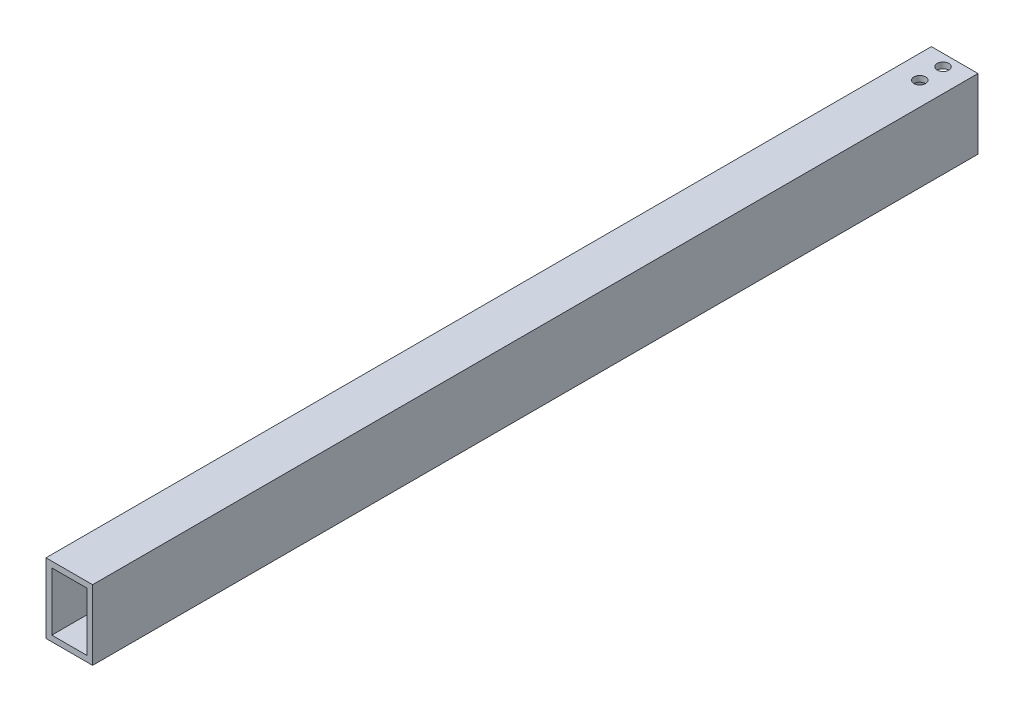
ISO-10303-21;
HEADER;
FILE_DESCRIPTION(('STEP AP214'),'2;1');
FILE_NAME('part.step','',(''),(''),'','','');
FILE_SCHEMA(('AUTOMOTIVE_DESIGN { 1 0 10303 214 1 1 1 1 }'));
ENDSEC;
DATA;
#1=APPLICATION_CONTEXT('core data for automotive mechanical design processes');
#2=APPLICATION_PROTOCOL_DEFINITION('international standard','automotive_design',2000,#1);
#3=PRODUCT_CONTEXT('',#1,'mechanical');
#4=PRODUCT('Part','Part','',(#3));
#5=PRODUCT_RELATED_PRODUCT_CATEGORY('part','',(#4));
#6=PRODUCT_DEFINITION_FORMATION('','',#4);
#7=PRODUCT_DEFINITION_CONTEXT('part definition',#1,'design');
#8=PRODUCT_DEFINITION('design','',#6,#7);
#9=PRODUCT_DEFINITION_SHAPE('','',#8);
#10=(LENGTH_UNIT() NAMED_UNIT(*) SI_UNIT(.MILLI.,.METRE.));
#11=(NAMED_UNIT(*) PLANE_ANGLE_UNIT() SI_UNIT($,.RADIAN.));
#12=(NAMED_UNIT(*) SI_UNIT($,.STERADIAN.) SOLID_ANGLE_UNIT());
#13=UNCERTAINTY_MEASURE_WITH_UNIT(LENGTH_MEASURE(1.E-05),#10,'distance_accuracy_value','');
#14=(GEOMETRIC_REPRESENTATION_CONTEXT(3) GLOBAL_UNCERTAINTY_ASSIGNED_CONTEXT((#13)) GLOBAL_UNIT_ASSIGNED_CONTEXT((#10,
#11,#12)) REPRESENTATION_CONTEXT('',''));
#15=CARTESIAN_POINT('',(0.,0.,0.));
#16=DIRECTION('',(0.,0.,1.));
#17=DIRECTION('',(1.,0.,0.));
#18=AXIS2_PLACEMENT_3D('',#15,#16,#17);
#19=CARTESIAN_POINT('',(0.,0.,482.6));
#20=DIRECTION('',(0.,0.,1.));
#21=DIRECTION('',(1.,0.,0.));
#22=AXIS2_PLACEMENT_3D('',#19,#20,#21);
#23=PLANE('',#22);
#24=DIRECTION('',(0.,1.,0.));
#25=VECTOR('',#24,1.);
#26=CARTESIAN_POINT('',(12.7,19.05,482.6));
#27=LINE('',#26,#25);
#28=CARTESIAN_POINT('',(12.7,-19.05,482.6));
#29=VERTEX_POINT('',#28);
#30=CARTESIAN_POINT('',(12.7,19.05,482.6));
#31=VERTEX_POINT('',#30);
#32=EDGE_CURVE('E142',#29,#31,#27,.T.);
#33=ORIENTED_EDGE('',*,*,#32,.T.);
#34=DIRECTION('',(-1.,0.,0.));
#35=VECTOR('',#34,1.);
#36=CARTESIAN_POINT('',(-12.7,19.05,482.6));
#37=LINE('',#36,#35);
#38=CARTESIAN_POINT('',(-12.7,19.05,482.6));
#39=VERTEX_POINT('',#38);
#40=EDGE_CURVE('E145',#31,#39,#37,.T.);
#41=ORIENTED_EDGE('',*,*,#40,.T.);
#42=DIRECTION('',(0.,-1.,0.));
#43=VECTOR('',#42,1.);
#44=CARTESIAN_POINT('',(-12.7,19.05,482.6));
#45=LINE('',#44,#43);
#46=CARTESIAN_POINT('',(-12.7,-19.05,482.6));
#47=VERTEX_POINT('',#46);
#48=EDGE_CURVE('E148',#39,#47,#45,.T.);
#49=ORIENTED_EDGE('',*,*,#48,.T.);
#50=DIRECTION('',(1.,0.,0.));
#51=VECTOR('',#50,1.);
#52=CARTESIAN_POINT('',(-12.7,-19.05,482.6));
#53=LINE('',#52,#51);
#54=EDGE_CURVE('E150',#47,#29,#53,.T.);
#55=ORIENTED_EDGE('',*,*,#54,.T.);
#56=EDGE_LOOP('',(#33,#41,#49,#55));
#57=FACE_BOUND('',#56,.T.);
#58=DIRECTION('',(-1.,0.,0.));
#59=VECTOR('',#58,1.);
#60=CARTESIAN_POINT('',(-9.52500000000001,15.875,482.6));
#61=LINE('',#60,#59);
#62=CARTESIAN_POINT('',(9.525,15.875,482.6));
#63=VERTEX_POINT('',#62);
#64=CARTESIAN_POINT('',(-9.52500000000001,15.875,482.6));
#65=VERTEX_POINT('',#64);
#66=EDGE_CURVE('E112',#63,#65,#61,.T.);
#67=ORIENTED_EDGE('',*,*,#66,.F.);
#68=DIRECTION('',(0.,1.,0.));
#69=VECTOR('',#68,1.);
#70=CARTESIAN_POINT('',(9.525,-15.875,482.6));
#71=LINE('',#70,#69);
#72=CARTESIAN_POINT('',(9.525,-15.875,482.6));
#73=VERTEX_POINT('',#72);
#74=EDGE_CURVE('E104',#73,#63,#71,.T.);
#75=ORIENTED_EDGE('',*,*,#74,.F.);
#76=DIRECTION('',(1.,0.,0.));
#77=VECTOR('',#76,1.);
#78=CARTESIAN_POINT('',(-9.52500000000001,-15.875,482.6));
#79=LINE('',#78,#77);
#80=CARTESIAN_POINT('',(-9.52500000000001,-15.875,482.6));
#81=VERTEX_POINT('',#80);
#82=EDGE_CURVE('E126',#81,#73,#79,.T.);
#83=ORIENTED_EDGE('',*,*,#82,.F.);
#84=DIRECTION('',(0.,-1.,0.));
#85=VECTOR('',#84,1.);
#86=CARTESIAN_POINT('',(-9.52500000000001,-15.875,482.6));
#87=LINE('',#86,#85);
#88=EDGE_CURVE('E124',#65,#81,#87,.T.);
#89=ORIENTED_EDGE('',*,*,#88,.F.);
#90=EDGE_LOOP('',(#67,#75,#83,#89));
#91=FACE_BOUND('',#90,.T.);
#92=ADVANCED_FACE('F37',(#57,#91),#23,.T.);
#93=CARTESIAN_POINT('',(0.,0.,0.));
#94=DIRECTION('',(0.,0.,1.));
#95=DIRECTION('',(1.,0.,0.));
#96=AXIS2_PLACEMENT_3D('',#93,#94,#95);
#97=PLANE('',#96);
#98=DIRECTION('',(0.,1.,0.));
#99=VECTOR('',#98,1.);
#100=CARTESIAN_POINT('',(12.7,19.05,0.));
#101=LINE('',#100,#99);
#102=CARTESIAN_POINT('',(12.7,-19.05,0.));
#103=VERTEX_POINT('',#102);
#104=CARTESIAN_POINT('',(12.7,19.05,0.));
#105=VERTEX_POINT('',#104);
#106=EDGE_CURVE('E120',#103,#105,#101,.T.);
#107=ORIENTED_EDGE('',*,*,#106,.F.);
#108=DIRECTION('',(1.,0.,0.));
#109=VECTOR('',#108,1.);
#110=CARTESIAN_POINT('',(-12.7,-19.05,0.));
#111=LINE('',#110,#109);
#112=CARTESIAN_POINT('',(-12.7,-19.05,0.));
#113=VERTEX_POINT('',#112);
#114=EDGE_CURVE('E146',#113,#103,#111,.T.);
#115=ORIENTED_EDGE('',*,*,#114,.F.);
#116=DIRECTION('',(0.,-1.,0.));
#117=VECTOR('',#116,1.);
#118=CARTESIAN_POINT('',(-12.7,19.05,0.));
#119=LINE('',#118,#117);
#120=CARTESIAN_POINT('',(-12.7,19.05,0.));
#121=VERTEX_POINT('',#120);
#122=EDGE_CURVE('E157',#121,#113,#119,.T.);
#123=ORIENTED_EDGE('',*,*,#122,.F.);
#124=DIRECTION('',(-1.,0.,0.));
#125=VECTOR('',#124,1.);
#126=CARTESIAN_POINT('',(-12.7,19.05,0.));
#127=LINE('',#126,#125);
#128=EDGE_CURVE('E155',#105,#121,#127,.T.);
#129=ORIENTED_EDGE('',*,*,#128,.F.);
#130=EDGE_LOOP('',(#107,#115,#123,#129));
#131=FACE_BOUND('',#130,.T.);
#132=DIRECTION('',(0.,1.,0.));
#133=VECTOR('',#132,1.);
#134=CARTESIAN_POINT('',(9.525,-15.875,0.));
#135=LINE('',#134,#133);
#136=CARTESIAN_POINT('',(9.525,-15.875,0.));
#137=VERTEX_POINT('',#136);
#138=CARTESIAN_POINT('',(9.525,15.875,0.));
#139=VERTEX_POINT('',#138);
#140=EDGE_CURVE('E62',#137,#139,#135,.T.);
#141=ORIENTED_EDGE('',*,*,#140,.T.);
#142=DIRECTION('',(-1.,0.,0.));
#143=VECTOR('',#142,1.);
#144=CARTESIAN_POINT('',(-9.52500000000001,15.875,0.));
#145=LINE('',#144,#143);
#146=CARTESIAN_POINT('',(-9.52500000000001,15.875,0.));
#147=VERTEX_POINT('',#146);
#148=EDGE_CURVE('E119',#139,#147,#145,.T.);
#149=ORIENTED_EDGE('',*,*,#148,.T.);
#150=DIRECTION('',(0.,-1.,0.));
#151=VECTOR('',#150,1.);
#152=CARTESIAN_POINT('',(-9.52500000000001,-15.875,0.));
#153=LINE('',#152,#151);
#154=CARTESIAN_POINT('',(-9.52500000000001,-15.875,0.));
#155=VERTEX_POINT('',#154);
#156=EDGE_CURVE('E134',#147,#155,#153,.T.);
#157=ORIENTED_EDGE('',*,*,#156,.T.);
#158=DIRECTION('',(1.,0.,0.));
#159=VECTOR('',#158,1.);
#160=CARTESIAN_POINT('',(-9.52500000000001,-15.875,0.));
#161=LINE('',#160,#159);
#162=EDGE_CURVE('E113',#155,#137,#161,.T.);
#163=ORIENTED_EDGE('',*,*,#162,.T.);
#164=EDGE_LOOP('',(#141,#149,#157,#163));
#165=FACE_BOUND('',#164,.T.);
#166=ADVANCED_FACE('F204',(#131,#165),#97,.F.);
#167=CARTESIAN_POINT('',(12.7,19.05,482.6));
#168=DIRECTION('',(-1.,0.,0.));
#169=DIRECTION('',(0.,0.,1.));
#170=AXIS2_PLACEMENT_3D('',#167,#168,#169);
#171=PLANE('',#170);
#172=ORIENTED_EDGE('',*,*,#106,.T.);
#173=DIRECTION('',(0.,0.,-1.));
#174=VECTOR('',#173,1.);
#175=CARTESIAN_POINT('',(12.7,19.05,482.6));
#176=LINE('',#175,#174);
#177=EDGE_CURVE('E11',#31,#105,#176,.T.);
#178=ORIENTED_EDGE('',*,*,#177,.F.);
#179=ORIENTED_EDGE('',*,*,#32,.F.);
#180=DIRECTION('',(0.,0.,-1.));
#181=VECTOR('',#180,1.);
#182=CARTESIAN_POINT('',(12.7,-19.05,482.6));
#183=LINE('',#182,#181);
#184=EDGE_CURVE('E152',#29,#103,#183,.T.);
#185=ORIENTED_EDGE('',*,*,#184,.T.);
#186=EDGE_LOOP('',(#172,#178,#179,#185));
#187=FACE_BOUND('',#186,.T.);
#188=ADVANCED_FACE('F39',(#187),#171,.F.);
#189=CARTESIAN_POINT('',(-12.7,19.05,482.6));
#190=DIRECTION('',(0.,-1.,0.));
#191=DIRECTION('',(0.,0.,-1.));
#192=AXIS2_PLACEMENT_3D('',#189,#190,#191);
#193=PLANE('',#192);
#194=CARTESIAN_POINT('',(0.,19.05,19.05));
#195=DIRECTION('',(0.,1.,0.));
#196=DIRECTION('',(0.,0.,1.));
#197=AXIS2_PLACEMENT_3D('',#194,#195,#196);
#198=CIRCLE('',#197,3.175);
#199=CARTESIAN_POINT('',(0.,19.05,22.225));
#200=VERTEX_POINT('',#199);
#201=EDGE_CURVE('E175',#200,#200,#198,.T.);
#202=ORIENTED_EDGE('',*,*,#201,.F.);
#203=EDGE_LOOP('',(#202));
#204=FACE_BOUND('',#203,.T.);
#205=CARTESIAN_POINT('',(0.,19.05,6.35000000000002));
#206=DIRECTION('',(0.,1.,0.));
#207=DIRECTION('',(0.,0.,1.));
#208=AXIS2_PLACEMENT_3D('',#205,#206,#207);
#209=CIRCLE('',#208,3.175);
#210=CARTESIAN_POINT('',(0.,19.05,9.52500000000002));
#211=VERTEX_POINT('',#210);
#212=EDGE_CURVE('E180',#211,#211,#209,.T.);
#213=ORIENTED_EDGE('',*,*,#212,.F.);
#214=EDGE_LOOP('',(#213));
#215=FACE_BOUND('',#214,.T.);
#216=ORIENTED_EDGE('',*,*,#128,.T.);
#217=DIRECTION('',(0.,0.,-1.));
#218=VECTOR('',#217,1.);
#219=CARTESIAN_POINT('',(-12.7,19.05,482.6));
#220=LINE('',#219,#218);
#221=EDGE_CURVE('E46',#39,#121,#220,.T.);
#222=ORIENTED_EDGE('',*,*,#221,.F.);
#223=ORIENTED_EDGE('',*,*,#40,.F.);
#224=ORIENTED_EDGE('',*,*,#177,.T.);
#225=EDGE_LOOP('',(#216,#222,#223,#224));
#226=FACE_BOUND('',#225,.T.);
#227=ADVANCED_FACE('F228',(#204,#215,#226),#193,.F.);
#228=CARTESIAN_POINT('',(-12.7,19.05,482.6));
#229=DIRECTION('',(1.,0.,0.));
#230=DIRECTION('',(0.,0.,-1.));
#231=AXIS2_PLACEMENT_3D('',#228,#229,#230);
#232=PLANE('',#231);
#233=ORIENTED_EDGE('',*,*,#122,.T.);
#234=DIRECTION('',(0.,0.,-1.));
#235=VECTOR('',#234,1.);
#236=CARTESIAN_POINT('',(-12.7,-19.05,482.6));
#237=LINE('',#236,#235);
#238=EDGE_CURVE('E162',#47,#113,#237,.T.);
#239=ORIENTED_EDGE('',*,*,#238,.F.);
#240=ORIENTED_EDGE('',*,*,#48,.F.);
#241=ORIENTED_EDGE('',*,*,#221,.T.);
#242=EDGE_LOOP('',(#233,#239,#240,#241));
#243=FACE_BOUND('',#242,.T.);
#244=ADVANCED_FACE('F226',(#243),#232,.F.);
#245=CARTESIAN_POINT('',(-12.7,-19.05,482.6));
#246=DIRECTION('',(0.,1.,0.));
#247=DIRECTION('',(0.,0.,1.));
#248=AXIS2_PLACEMENT_3D('',#245,#246,#247);
#249=PLANE('',#248);
#250=CARTESIAN_POINT('',(0.,-19.05,19.05));
#251=DIRECTION('',(0.,1.,0.));
#252=DIRECTION('',(0.,0.,1.));
#253=AXIS2_PLACEMENT_3D('',#250,#251,#252);
#254=CIRCLE('',#253,3.175);
#255=CARTESIAN_POINT('',(0.,-19.05,22.225));
#256=VERTEX_POINT('',#255);
#257=EDGE_CURVE('E169',#256,#256,#254,.T.);
#258=ORIENTED_EDGE('',*,*,#257,.T.);
#259=EDGE_LOOP('',(#258));
#260=FACE_BOUND('',#259,.T.);
#261=CARTESIAN_POINT('',(0.,-19.05,6.35000000000002));
#262=DIRECTION('',(0.,1.,0.));
#263=DIRECTION('',(0.,0.,1.));
#264=AXIS2_PLACEMENT_3D('',#261,#262,#263);
#265=CIRCLE('',#264,3.175);
#266=CARTESIAN_POINT('',(0.,-19.05,9.52500000000002));
#267=VERTEX_POINT('',#266);
#268=EDGE_CURVE('E185',#267,#267,#265,.T.);
#269=ORIENTED_EDGE('',*,*,#268,.T.);
#270=EDGE_LOOP('',(#269));
#271=FACE_BOUND('',#270,.T.);
#272=ORIENTED_EDGE('',*,*,#114,.T.);
#273=ORIENTED_EDGE('',*,*,#184,.F.);
#274=ORIENTED_EDGE('',*,*,#54,.F.);
#275=ORIENTED_EDGE('',*,*,#238,.T.);
#276=EDGE_LOOP('',(#272,#273,#274,#275));
#277=FACE_BOUND('',#276,.T.);
#278=ADVANCED_FACE('F223',(#260,#271,#277),#249,.F.);
#279=CARTESIAN_POINT('',(9.525,-15.875,482.6));
#280=DIRECTION('',(-1.,0.,0.));
#281=DIRECTION('',(0.,0.,1.));
#282=AXIS2_PLACEMENT_3D('',#279,#280,#281);
#283=PLANE('',#282);
#284=ORIENTED_EDGE('',*,*,#140,.F.);
#285=DIRECTION('',(0.,0.,-1.));
#286=VECTOR('',#285,1.);
#287=CARTESIAN_POINT('',(9.525,-15.875,482.6));
#288=LINE('',#287,#286);
#289=EDGE_CURVE('E108',#73,#137,#288,.T.);
#290=ORIENTED_EDGE('',*,*,#289,.F.);
#291=ORIENTED_EDGE('',*,*,#74,.T.);
#292=DIRECTION('',(0.,0.,-1.));
#293=VECTOR('',#292,1.);
#294=CARTESIAN_POINT('',(9.525,15.875,482.6));
#295=LINE('',#294,#293);
#296=EDGE_CURVE('E107',#63,#139,#295,.T.);
#297=ORIENTED_EDGE('',*,*,#296,.T.);
#298=EDGE_LOOP('',(#284,#290,#291,#297));
#299=FACE_BOUND('',#298,.T.);
#300=ADVANCED_FACE('F106',(#299),#283,.T.);
#301=CARTESIAN_POINT('',(-9.52500000000001,15.875,482.6));
#302=DIRECTION('',(0.,-1.,0.));
#303=DIRECTION('',(0.,0.,-1.));
#304=AXIS2_PLACEMENT_3D('',#301,#302,#303);
#305=PLANE('',#304);
#306=CARTESIAN_POINT('',(0.,15.875,19.05));
#307=DIRECTION('',(0.,-1.,0.));
#308=DIRECTION('',(0.,0.,-1.));
#309=AXIS2_PLACEMENT_3D('',#306,#307,#308);
#310=CIRCLE('',#309,3.175);
#311=CARTESIAN_POINT('',(0.,15.875,22.225));
#312=VERTEX_POINT('',#311);
#313=EDGE_CURVE('E132',#312,#312,#310,.T.);
#314=ORIENTED_EDGE('',*,*,#313,.F.);
#315=EDGE_LOOP('',(#314));
#316=FACE_BOUND('',#315,.T.);
#317=CARTESIAN_POINT('',(0.,15.875,6.35000000000002));
#318=DIRECTION('',(0.,-1.,0.));
#319=DIRECTION('',(0.,0.,-1.));
#320=AXIS2_PLACEMENT_3D('',#317,#318,#319);
#321=CIRCLE('',#320,3.175);
#322=CARTESIAN_POINT('',(0.,15.875,9.52500000000002));
#323=VERTEX_POINT('',#322);
#324=EDGE_CURVE('E168',#323,#323,#321,.T.);
#325=ORIENTED_EDGE('',*,*,#324,.F.);
#326=EDGE_LOOP('',(#325));
#327=FACE_BOUND('',#326,.T.);
#328=ORIENTED_EDGE('',*,*,#148,.F.);
#329=ORIENTED_EDGE('',*,*,#296,.F.);
#330=ORIENTED_EDGE('',*,*,#66,.T.);
#331=DIRECTION('',(0.,0.,-1.));
#332=VECTOR('',#331,1.);
#333=CARTESIAN_POINT('',(-9.52500000000001,15.875,482.6));
#334=LINE('',#333,#332);
#335=EDGE_CURVE('E121',#65,#147,#334,.T.);
#336=ORIENTED_EDGE('',*,*,#335,.T.);
#337=EDGE_LOOP('',(#328,#329,#330,#336));
#338=FACE_BOUND('',#337,.T.);
#339=ADVANCED_FACE('F116',(#316,#327,#338),#305,.T.);
#340=CARTESIAN_POINT('',(-9.52500000000001,-15.875,482.6));
#341=DIRECTION('',(1.,0.,0.));
#342=DIRECTION('',(0.,0.,-1.));
#343=AXIS2_PLACEMENT_3D('',#340,#341,#342);
#344=PLANE('',#343);
#345=ORIENTED_EDGE('',*,*,#156,.F.);
#346=ORIENTED_EDGE('',*,*,#335,.F.);
#347=ORIENTED_EDGE('',*,*,#88,.T.);
#348=DIRECTION('',(0.,0.,-1.));
#349=VECTOR('',#348,1.);
#350=CARTESIAN_POINT('',(-9.52500000000001,-15.875,482.6));
#351=LINE('',#350,#349);
#352=EDGE_CURVE('E54',#81,#155,#351,.T.);
#353=ORIENTED_EDGE('',*,*,#352,.T.);
#354=EDGE_LOOP('',(#345,#346,#347,#353));
#355=FACE_BOUND('',#354,.T.);
#356=ADVANCED_FACE('F200',(#355),#344,.T.);
#357=CARTESIAN_POINT('',(-9.52500000000001,-15.875,482.6));
#358=DIRECTION('',(0.,1.,0.));
#359=DIRECTION('',(0.,0.,1.));
#360=AXIS2_PLACEMENT_3D('',#357,#358,#359);
#361=PLANE('',#360);
#362=CARTESIAN_POINT('',(0.,-15.875,19.05));
#363=DIRECTION('',(0.,1.,0.));
#364=DIRECTION('',(0.,0.,1.));
#365=AXIS2_PLACEMENT_3D('',#362,#363,#364);
#366=CIRCLE('',#365,3.175);
#367=CARTESIAN_POINT('',(0.,-15.875,22.225));
#368=VERTEX_POINT('',#367);
#369=EDGE_CURVE('E41',#368,#368,#366,.T.);
#370=ORIENTED_EDGE('',*,*,#369,.F.);
#371=EDGE_LOOP('',(#370));
#372=FACE_BOUND('',#371,.T.);
#373=CARTESIAN_POINT('',(0.,-15.875,6.35000000000002));
#374=DIRECTION('',(0.,1.,0.));
#375=DIRECTION('',(0.,0.,1.));
#376=AXIS2_PLACEMENT_3D('',#373,#374,#375);
#377=CIRCLE('',#376,3.175);
#378=CARTESIAN_POINT('',(0.,-15.875,9.52500000000002));
#379=VERTEX_POINT('',#378);
#380=EDGE_CURVE('E166',#379,#379,#377,.T.);
#381=ORIENTED_EDGE('',*,*,#380,.F.);
#382=EDGE_LOOP('',(#381));
#383=FACE_BOUND('',#382,.T.);
#384=ORIENTED_EDGE('',*,*,#162,.F.);
#385=ORIENTED_EDGE('',*,*,#352,.F.);
#386=ORIENTED_EDGE('',*,*,#82,.T.);
#387=ORIENTED_EDGE('',*,*,#289,.T.);
#388=EDGE_LOOP('',(#384,#385,#386,#387));
#389=FACE_BOUND('',#388,.T.);
#390=ADVANCED_FACE('F196',(#372,#383,#389),#361,.T.);
#391=CARTESIAN_POINT('',(0.,-19.05,6.35000000000002));
#392=DIRECTION('',(0.,1.,0.));
#393=DIRECTION('',(0.,0.,1.));
#394=AXIS2_PLACEMENT_3D('',#391,#392,#393);
#395=CYLINDRICAL_SURFACE('',#394,3.175);
#396=CARTESIAN_POINT('',(0.,-15.875,9.52500000000002));
#397=CARTESIAN_POINT('',(0.,-15.9080729166667,9.52500000000002));
#398=CARTESIAN_POINT('',(0.,-15.9411458333333,9.52500000000002));
#399=CARTESIAN_POINT('',(0.,-16.0072916666667,9.52500000000002));
#400=CARTESIAN_POINT('',(0.,-16.0403645833333,9.52500000000002));
#401=CARTESIAN_POINT('',(0.,-16.1065104166667,9.52500000000002));
#402=CARTESIAN_POINT('',(0.,-16.1395833333333,9.52500000000002));
#403=CARTESIAN_POINT('',(0.,-16.2057291666667,9.52500000000002));
#404=CARTESIAN_POINT('',(0.,-16.2388020833333,9.52500000000002));
#405=CARTESIAN_POINT('',(0.,-16.3049479166667,9.52500000000002));
#406=CARTESIAN_POINT('',(0.,-16.3380208333333,9.52500000000002));
#407=CARTESIAN_POINT('',(0.,-16.4041666666667,9.52500000000002));
#408=CARTESIAN_POINT('',(0.,-16.4372395833333,9.52500000000002));
#409=CARTESIAN_POINT('',(0.,-16.5033854166667,9.52500000000002));
#410=CARTESIAN_POINT('',(0.,-16.5364583333333,9.52500000000002));
#411=CARTESIAN_POINT('',(0.,-16.6026041666667,9.52500000000002));
#412=CARTESIAN_POINT('',(0.,-16.6356770833333,9.52500000000002));
#413=CARTESIAN_POINT('',(0.,-16.7018229166667,9.52500000000002));
#414=CARTESIAN_POINT('',(0.,-16.7348958333333,9.52500000000002));
#415=CARTESIAN_POINT('',(0.,-16.8010416666667,9.52500000000002));
#416=CARTESIAN_POINT('',(0.,-16.8341145833333,9.52500000000002));
#417=CARTESIAN_POINT('',(0.,-16.9002604166667,9.52500000000002));
#418=CARTESIAN_POINT('',(0.,-16.9333333333333,9.52500000000002));
#419=CARTESIAN_POINT('',(0.,-16.9994791666667,9.52500000000002));
#420=CARTESIAN_POINT('',(0.,-17.0325520833333,9.52500000000002));
#421=CARTESIAN_POINT('',(0.,-17.0986979166667,9.52500000000002));
#422=CARTESIAN_POINT('',(0.,-17.1317708333333,9.52500000000002));
#423=CARTESIAN_POINT('',(0.,-17.1979166666667,9.52500000000002));
#424=CARTESIAN_POINT('',(0.,-17.2309895833333,9.52500000000002));
#425=CARTESIAN_POINT('',(0.,-17.2971354166667,9.52500000000002));
#426=CARTESIAN_POINT('',(0.,-17.3302083333333,9.52500000000002));
#427=CARTESIAN_POINT('',(0.,-17.3963541666667,9.52500000000002));
#428=CARTESIAN_POINT('',(0.,-17.4294270833333,9.52500000000002));
#429=CARTESIAN_POINT('',(0.,-17.4955729166667,9.52500000000002));
#430=CARTESIAN_POINT('',(0.,-17.5286458333333,9.52500000000002));
#431=CARTESIAN_POINT('',(0.,-17.5947916666667,9.52500000000002));
#432=CARTESIAN_POINT('',(0.,-17.6278645833333,9.52500000000002));
#433=CARTESIAN_POINT('',(0.,-17.6940104166667,9.52500000000002));
#434=CARTESIAN_POINT('',(0.,-17.7270833333333,9.52500000000002));
#435=CARTESIAN_POINT('',(0.,-17.7932291666667,9.52500000000002));
#436=CARTESIAN_POINT('',(0.,-17.8263020833333,9.52500000000002));
#437=CARTESIAN_POINT('',(0.,-17.8924479166667,9.52500000000002));
#438=CARTESIAN_POINT('',(0.,-17.9255208333333,9.52500000000002));
#439=CARTESIAN_POINT('',(0.,-17.9916666666667,9.52500000000002));
#440=CARTESIAN_POINT('',(0.,-18.0247395833333,9.52500000000002));
#441=CARTESIAN_POINT('',(0.,-18.0908854166667,9.52500000000002));
#442=CARTESIAN_POINT('',(0.,-18.1239583333333,9.52500000000002));
#443=CARTESIAN_POINT('',(0.,-18.1901041666667,9.52500000000002));
#444=CARTESIAN_POINT('',(0.,-18.2231770833333,9.52500000000002));
#445=CARTESIAN_POINT('',(0.,-18.2893229166667,9.52500000000002));
#446=CARTESIAN_POINT('',(0.,-18.3223958333333,9.52500000000002));
#447=CARTESIAN_POINT('',(0.,-18.3885416666667,9.52500000000002));
#448=CARTESIAN_POINT('',(0.,-18.4216145833333,9.52500000000002));
#449=CARTESIAN_POINT('',(0.,-18.4877604166667,9.52500000000002));
#450=CARTESIAN_POINT('',(0.,-18.5208333333333,9.52500000000002));
#451=CARTESIAN_POINT('',(0.,-18.5869791666667,9.52500000000002));
#452=CARTESIAN_POINT('',(0.,-18.6200520833333,9.52500000000002));
#453=CARTESIAN_POINT('',(0.,-18.6861979166667,9.52500000000002));
#454=CARTESIAN_POINT('',(0.,-18.7192708333333,9.52500000000002));
#455=CARTESIAN_POINT('',(0.,-18.7854166666667,9.52500000000002));
#456=CARTESIAN_POINT('',(0.,-18.8184895833333,9.52500000000002));
#457=CARTESIAN_POINT('',(0.,-18.8846354166667,9.52500000000002));
#458=CARTESIAN_POINT('',(0.,-18.9177083333333,9.52500000000002));
#459=CARTESIAN_POINT('',(0.,-18.9838541666667,9.52500000000002));
#460=CARTESIAN_POINT('',(0.,-19.0169270833333,9.52500000000002));
#461=CARTESIAN_POINT('',(0.,-19.05,9.52500000000002));
#462=B_SPLINE_CURVE_WITH_KNOTS('',3,(#396,#397,#398,#399,#400,#401,#402,#403,#404,#405,#406,
#407,#408,#409,#410,#411,#412,#413,#414,#415,#416,#417,#418,#419,#420,#421,#422,#423,#424,#425,
#426,#427,#428,#429,#430,#431,#432,#433,#434,#435,#436,#437,#438,#439,#440,#441,#442,#443,#444,
#445,#446,#447,#448,#449,#450,#451,#452,#453,#454,#455,#456,#457,#458,#459,#460,#461),
.UNSPECIFIED.,.F.,.F.,(4,2,2,2,2,2,2,2,2,2,2,2,2,2,2,2,2,2,2,2,2,2,2,2,2,2,2,2,2,2,2,2,4),(0.,
0.0992187499999977,0.198437499999999,0.29765625,0.396874999999998,0.496093749999999,0.5953125,
0.694531249999998,0.793749999999999,0.892968749999997,0.992187499999998,1.09140625,1.190625,
1.28984375,1.3890625,1.48828125,1.5875,1.68671875,1.7859375,1.88515625,1.984375,2.08359375,
2.1828125,2.28203125,2.38125,2.48046875,2.5796875,2.67890625,2.778125,2.87734375,2.9765625,
3.07578125,3.175),.UNSPECIFIED.);
#463=EDGE_CURVE('BSEAM199',#379,#267,#462,.T.);
#464=ORIENTED_EDGE('',*,*,#380,.T.);
#465=ORIENTED_EDGE('',*,*,#268,.F.);
#466=ORIENTED_EDGE('',*,*,#463,.T.);
#467=ORIENTED_EDGE('',*,*,#463,.F.);
#468=EDGE_LOOP('',(#464,#466,#465,#467));
#469=FACE_BOUND('',#468,.T.);
#470=ADVANCED_FACE('F199',(#469),#395,.F.);
#471=CARTESIAN_POINT('',(0.,-19.05,19.05));
#472=DIRECTION('',(0.,1.,0.));
#473=DIRECTION('',(0.,0.,1.));
#474=AXIS2_PLACEMENT_3D('',#471,#472,#473);
#475=CYLINDRICAL_SURFACE('',#474,3.175);
#476=CARTESIAN_POINT('',(0.,-15.875,22.225));
#477=CARTESIAN_POINT('',(0.,-15.9080729166667,22.225));
#478=CARTESIAN_POINT('',(0.,-15.9411458333333,22.225));
#479=CARTESIAN_POINT('',(0.,-16.0072916666667,22.225));
#480=CARTESIAN_POINT('',(0.,-16.0403645833333,22.225));
#481=CARTESIAN_POINT('',(0.,-16.1065104166667,22.225));
#482=CARTESIAN_POINT('',(0.,-16.1395833333333,22.225));
#483=CARTESIAN_POINT('',(0.,-16.2057291666667,22.225));
#484=CARTESIAN_POINT('',(0.,-16.2388020833333,22.225));
#485=CARTESIAN_POINT('',(0.,-16.3049479166667,22.225));
#486=CARTESIAN_POINT('',(0.,-16.3380208333333,22.225));
#487=CARTESIAN_POINT('',(0.,-16.4041666666667,22.225));
#488=CARTESIAN_POINT('',(0.,-16.4372395833333,22.225));
#489=CARTESIAN_POINT('',(0.,-16.5033854166667,22.225));
#490=CARTESIAN_POINT('',(0.,-16.5364583333333,22.225));
#491=CARTESIAN_POINT('',(0.,-16.6026041666667,22.225));
#492=CARTESIAN_POINT('',(0.,-16.6356770833333,22.225));
#493=CARTESIAN_POINT('',(0.,-16.7018229166667,22.225));
#494=CARTESIAN_POINT('',(0.,-16.7348958333333,22.225));
#495=CARTESIAN_POINT('',(0.,-16.8010416666667,22.225));
#496=CARTESIAN_POINT('',(0.,-16.8341145833333,22.225));
#497=CARTESIAN_POINT('',(0.,-16.9002604166667,22.225));
#498=CARTESIAN_POINT('',(0.,-16.9333333333333,22.225));
#499=CARTESIAN_POINT('',(0.,-16.9994791666667,22.225));
#500=CARTESIAN_POINT('',(0.,-17.0325520833333,22.225));
#501=CARTESIAN_POINT('',(0.,-17.0986979166667,22.225));
#502=CARTESIAN_POINT('',(0.,-17.1317708333333,22.225));
#503=CARTESIAN_POINT('',(0.,-17.1979166666667,22.225));
#504=CARTESIAN_POINT('',(0.,-17.2309895833333,22.225));
#505=CARTESIAN_POINT('',(0.,-17.2971354166667,22.225));
#506=CARTESIAN_POINT('',(0.,-17.3302083333333,22.225));
#507=CARTESIAN_POINT('',(0.,-17.3963541666667,22.225));
#508=CARTESIAN_POINT('',(0.,-17.4294270833333,22.225));
#509=CARTESIAN_POINT('',(0.,-17.4955729166667,22.225));
#510=CARTESIAN_POINT('',(0.,-17.5286458333333,22.225));
#511=CARTESIAN_POINT('',(0.,-17.5947916666667,22.225));
#512=CARTESIAN_POINT('',(0.,-17.6278645833333,22.225));
#513=CARTESIAN_POINT('',(0.,-17.6940104166667,22.225));
#514=CARTESIAN_POINT('',(0.,-17.7270833333333,22.225));
#515=CARTESIAN_POINT('',(0.,-17.7932291666667,22.225));
#516=CARTESIAN_POINT('',(0.,-17.8263020833333,22.225));
#517=CARTESIAN_POINT('',(0.,-17.8924479166667,22.225));
#518=CARTESIAN_POINT('',(0.,-17.9255208333333,22.225));
#519=CARTESIAN_POINT('',(0.,-17.9916666666667,22.225));
#520=CARTESIAN_POINT('',(0.,-18.0247395833333,22.225));
#521=CARTESIAN_POINT('',(0.,-18.0908854166667,22.225));
#522=CARTESIAN_POINT('',(0.,-18.1239583333333,22.225));
#523=CARTESIAN_POINT('',(0.,-18.1901041666667,22.225));
#524=CARTESIAN_POINT('',(0.,-18.2231770833333,22.225));
#525=CARTESIAN_POINT('',(0.,-18.2893229166667,22.225));
#526=CARTESIAN_POINT('',(0.,-18.3223958333333,22.225));
#527=CARTESIAN_POINT('',(0.,-18.3885416666667,22.225));
#528=CARTESIAN_POINT('',(0.,-18.4216145833333,22.225));
#529=CARTESIAN_POINT('',(0.,-18.4877604166667,22.225));
#530=CARTESIAN_POINT('',(0.,-18.5208333333333,22.225));
#531=CARTESIAN_POINT('',(0.,-18.5869791666667,22.225));
#532=CARTESIAN_POINT('',(0.,-18.6200520833333,22.225));
#533=CARTESIAN_POINT('',(0.,-18.6861979166667,22.225));
#534=CARTESIAN_POINT('',(0.,-18.7192708333333,22.225));
#535=CARTESIAN_POINT('',(0.,-18.7854166666667,22.225));
#536=CARTESIAN_POINT('',(0.,-18.8184895833333,22.225));
#537=CARTESIAN_POINT('',(0.,-18.8846354166667,22.225));
#538=CARTESIAN_POINT('',(0.,-18.9177083333333,22.225));
#539=CARTESIAN_POINT('',(0.,-18.9838541666667,22.225));
#540=CARTESIAN_POINT('',(0.,-19.0169270833333,22.225));
#541=CARTESIAN_POINT('',(0.,-19.05,22.225));
#542=B_SPLINE_CURVE_WITH_KNOTS('',3,(#476,#477,#478,#479,#480,#481,#482,#483,#484,#485,#486,
#487,#488,#489,#490,#491,#492,#493,#494,#495,#496,#497,#498,#499,#500,#501,#502,#503,#504,#505,
#506,#507,#508,#509,#510,#511,#512,#513,#514,#515,#516,#517,#518,#519,#520,#521,#522,#523,#524,
#525,#526,#527,#528,#529,#530,#531,#532,#533,#534,#535,#536,#537,#538,#539,#540,#541),
.UNSPECIFIED.,.F.,.F.,(4,2,2,2,2,2,2,2,2,2,2,2,2,2,2,2,2,2,2,2,2,2,2,2,2,2,2,2,2,2,2,2,4),(0.,
0.0992187499999977,0.198437499999999,0.29765625,0.396874999999998,0.496093749999999,0.5953125,
0.694531249999998,0.793749999999999,0.892968749999997,0.992187499999998,1.09140625,1.190625,
1.28984375,1.3890625,1.48828125,1.5875,1.68671875,1.7859375,1.88515625,1.984375,2.08359375,
2.1828125,2.28203125,2.38125,2.48046875,2.5796875,2.67890625,2.778125,2.87734375,2.9765625,
3.07578125,3.175),.UNSPECIFIED.);
#543=EDGE_CURVE('BSEAM193',#368,#256,#542,.T.);
#544=ORIENTED_EDGE('',*,*,#369,.T.);
#545=ORIENTED_EDGE('',*,*,#257,.F.);
#546=ORIENTED_EDGE('',*,*,#543,.T.);
#547=ORIENTED_EDGE('',*,*,#543,.F.);
#548=EDGE_LOOP('',(#544,#546,#545,#547));
#549=FACE_BOUND('',#548,.T.);
#550=ADVANCED_FACE('F193',(#549),#475,.F.);
#551=CARTESIAN_POINT('',(0.,15.875,9.52500000000002));
#552=CARTESIAN_POINT('',(0.,15.9080729166667,9.52500000000002));
#553=CARTESIAN_POINT('',(0.,15.9411458333333,9.52500000000002));
#554=CARTESIAN_POINT('',(0.,16.0072916666667,9.52500000000002));
#555=CARTESIAN_POINT('',(0.,16.0403645833333,9.52500000000002));
#556=CARTESIAN_POINT('',(0.,16.1065104166667,9.52500000000002));
#557=CARTESIAN_POINT('',(0.,16.1395833333333,9.52500000000002));
#558=CARTESIAN_POINT('',(0.,16.2057291666667,9.52500000000002));
#559=CARTESIAN_POINT('',(0.,16.2388020833333,9.52500000000002));
#560=CARTESIAN_POINT('',(0.,16.3049479166667,9.52500000000002));
#561=CARTESIAN_POINT('',(0.,16.3380208333333,9.52500000000002));
#562=CARTESIAN_POINT('',(0.,16.4041666666667,9.52500000000002));
#563=CARTESIAN_POINT('',(0.,16.4372395833333,9.52500000000002));
#564=CARTESIAN_POINT('',(0.,16.5033854166667,9.52500000000002));
#565=CARTESIAN_POINT('',(0.,16.5364583333333,9.52500000000002));
#566=CARTESIAN_POINT('',(0.,16.6026041666667,9.52500000000002));
#567=CARTESIAN_POINT('',(0.,16.6356770833333,9.52500000000002));
#568=CARTESIAN_POINT('',(0.,16.7018229166667,9.52500000000002));
#569=CARTESIAN_POINT('',(0.,16.7348958333333,9.52500000000002));
#570=CARTESIAN_POINT('',(0.,16.8010416666667,9.52500000000002));
#571=CARTESIAN_POINT('',(0.,16.8341145833333,9.52500000000002));
#572=CARTESIAN_POINT('',(0.,16.9002604166667,9.52500000000002));
#573=CARTESIAN_POINT('',(0.,16.9333333333333,9.52500000000002));
#574=CARTESIAN_POINT('',(0.,16.9994791666667,9.52500000000002));
#575=CARTESIAN_POINT('',(0.,17.0325520833333,9.52500000000002));
#576=CARTESIAN_POINT('',(0.,17.0986979166667,9.52500000000002));
#577=CARTESIAN_POINT('',(0.,17.1317708333333,9.52500000000002));
#578=CARTESIAN_POINT('',(0.,17.1979166666667,9.52500000000002));
#579=CARTESIAN_POINT('',(0.,17.2309895833333,9.52500000000002));
#580=CARTESIAN_POINT('',(0.,17.2971354166667,9.52500000000002));
#581=CARTESIAN_POINT('',(0.,17.3302083333333,9.52500000000002));
#582=CARTESIAN_POINT('',(0.,17.3963541666667,9.52500000000002));
#583=CARTESIAN_POINT('',(0.,17.4294270833333,9.52500000000002));
#584=CARTESIAN_POINT('',(0.,17.4955729166667,9.52500000000002));
#585=CARTESIAN_POINT('',(0.,17.5286458333333,9.52500000000002));
#586=CARTESIAN_POINT('',(0.,17.5947916666667,9.52500000000002));
#587=CARTESIAN_POINT('',(0.,17.6278645833333,9.52500000000002));
#588=CARTESIAN_POINT('',(0.,17.6940104166667,9.52500000000002));
#589=CARTESIAN_POINT('',(0.,17.7270833333333,9.52500000000002));
#590=CARTESIAN_POINT('',(0.,17.7932291666667,9.52500000000002));
#591=CARTESIAN_POINT('',(0.,17.8263020833333,9.52500000000002));
#592=CARTESIAN_POINT('',(0.,17.8924479166667,9.52500000000002));
#593=CARTESIAN_POINT('',(0.,17.9255208333333,9.52500000000002));
#594=CARTESIAN_POINT('',(0.,17.9916666666667,9.52500000000002));
#595=CARTESIAN_POINT('',(0.,18.0247395833333,9.52500000000002));
#596=CARTESIAN_POINT('',(0.,18.0908854166667,9.52500000000002));
#597=CARTESIAN_POINT('',(0.,18.1239583333333,9.52500000000002));
#598=CARTESIAN_POINT('',(0.,18.1901041666667,9.52500000000002));
#599=CARTESIAN_POINT('',(0.,18.2231770833333,9.52500000000002));
#600=CARTESIAN_POINT('',(0.,18.2893229166667,9.52500000000002));
#601=CARTESIAN_POINT('',(0.,18.3223958333333,9.52500000000002));
#602=CARTESIAN_POINT('',(0.,18.3885416666667,9.52500000000002));
#603=CARTESIAN_POINT('',(0.,18.4216145833333,9.52500000000002));
#604=CARTESIAN_POINT('',(0.,18.4877604166667,9.52500000000002));
#605=CARTESIAN_POINT('',(0.,18.5208333333333,9.52500000000002));
#606=CARTESIAN_POINT('',(0.,18.5869791666667,9.52500000000002));
#607=CARTESIAN_POINT('',(0.,18.6200520833333,9.52500000000002));
#608=CARTESIAN_POINT('',(0.,18.6861979166667,9.52500000000002));
#609=CARTESIAN_POINT('',(0.,18.7192708333333,9.52500000000002));
#610=CARTESIAN_POINT('',(0.,18.7854166666667,9.52500000000002));
#611=CARTESIAN_POINT('',(0.,18.8184895833333,9.52500000000002));
#612=CARTESIAN_POINT('',(0.,18.8846354166667,9.52500000000002));
#613=CARTESIAN_POINT('',(0.,18.9177083333333,9.52500000000002));
#614=CARTESIAN_POINT('',(0.,18.9838541666667,9.52500000000002));
#615=CARTESIAN_POINT('',(0.,19.0169270833333,9.52500000000002));
#616=CARTESIAN_POINT('',(0.,19.05,9.52500000000002));
#617=B_SPLINE_CURVE_WITH_KNOTS('',3,(#551,#552,#553,#554,#555,#556,#557,#558,#559,#560,#561,
#562,#563,#564,#565,#566,#567,#568,#569,#570,#571,#572,#573,#574,#575,#576,#577,#578,#579,#580,
#581,#582,#583,#584,#585,#586,#587,#588,#589,#590,#591,#592,#593,#594,#595,#596,#597,#598,#599,
#600,#601,#602,#603,#604,#605,#606,#607,#608,#609,#610,#611,#612,#613,#614,#615,#616),
.UNSPECIFIED.,.F.,.F.,(4,2,2,2,2,2,2,2,2,2,2,2,2,2,2,2,2,2,2,2,2,2,2,2,2,2,2,2,2,2,2,2,4),(0.,
0.0992187499999977,0.198437500000002,0.29765625,0.396875000000005,0.496093750000003,0.5953125,
0.694531250000005,0.793750000000003,0.892968750000001,0.992187500000005,1.09140625,1.190625,
1.28984375000001,1.3890625,1.48828125000001,1.58750000000001,1.68671875,1.78593750000001,
1.88515625000001,1.98437500000001,2.08359375000001,2.18281250000001,2.28203125000001,
2.38125000000001,2.48046875000001,2.57968750000001,2.67890625000001,2.77812500000001,
2.87734375000001,2.97656250000001,3.07578125000001,3.17500000000001),.UNSPECIFIED.);
#618=EDGE_CURVE('BSEAM252',#323,#211,#617,.T.);
#619=ORIENTED_EDGE('',*,*,#324,.T.);
#620=ORIENTED_EDGE('',*,*,#212,.T.);
#621=ORIENTED_EDGE('',*,*,#618,.T.);
#622=ORIENTED_EDGE('',*,*,#618,.F.);
#623=EDGE_LOOP('',(#619,#621,#620,#622));
#624=FACE_BOUND('',#623,.T.);
#625=ADVANCED_FACE('F252',(#624),#395,.F.);
#626=CARTESIAN_POINT('',(0.,15.875,22.225));
#627=CARTESIAN_POINT('',(0.,15.9080729166667,22.225));
#628=CARTESIAN_POINT('',(0.,15.9411458333333,22.225));
#629=CARTESIAN_POINT('',(0.,16.0072916666667,22.225));
#630=CARTESIAN_POINT('',(0.,16.0403645833333,22.225));
#631=CARTESIAN_POINT('',(0.,16.1065104166667,22.225));
#632=CARTESIAN_POINT('',(0.,16.1395833333333,22.225));
#633=CARTESIAN_POINT('',(0.,16.2057291666667,22.225));
#634=CARTESIAN_POINT('',(0.,16.2388020833333,22.225));
#635=CARTESIAN_POINT('',(0.,16.3049479166667,22.225));
#636=CARTESIAN_POINT('',(0.,16.3380208333333,22.225));
#637=CARTESIAN_POINT('',(0.,16.4041666666667,22.225));
#638=CARTESIAN_POINT('',(0.,16.4372395833333,22.225));
#639=CARTESIAN_POINT('',(0.,16.5033854166667,22.225));
#640=CARTESIAN_POINT('',(0.,16.5364583333333,22.225));
#641=CARTESIAN_POINT('',(0.,16.6026041666667,22.225));
#642=CARTESIAN_POINT('',(0.,16.6356770833333,22.225));
#643=CARTESIAN_POINT('',(0.,16.7018229166667,22.225));
#644=CARTESIAN_POINT('',(0.,16.7348958333333,22.225));
#645=CARTESIAN_POINT('',(0.,16.8010416666667,22.225));
#646=CARTESIAN_POINT('',(0.,16.8341145833333,22.225));
#647=CARTESIAN_POINT('',(0.,16.9002604166667,22.225));
#648=CARTESIAN_POINT('',(0.,16.9333333333333,22.225));
#649=CARTESIAN_POINT('',(0.,16.9994791666667,22.225));
#650=CARTESIAN_POINT('',(0.,17.0325520833333,22.225));
#651=CARTESIAN_POINT('',(0.,17.0986979166667,22.225));
#652=CARTESIAN_POINT('',(0.,17.1317708333333,22.225));
#653=CARTESIAN_POINT('',(0.,17.1979166666667,22.225));
#654=CARTESIAN_POINT('',(0.,17.2309895833333,22.225));
#655=CARTESIAN_POINT('',(0.,17.2971354166667,22.225));
#656=CARTESIAN_POINT('',(0.,17.3302083333333,22.225));
#657=CARTESIAN_POINT('',(0.,17.3963541666667,22.225));
#658=CARTESIAN_POINT('',(0.,17.4294270833333,22.225));
#659=CARTESIAN_POINT('',(0.,17.4955729166667,22.225));
#660=CARTESIAN_POINT('',(0.,17.5286458333333,22.225));
#661=CARTESIAN_POINT('',(0.,17.5947916666667,22.225));
#662=CARTESIAN_POINT('',(0.,17.6278645833333,22.225));
#663=CARTESIAN_POINT('',(0.,17.6940104166667,22.225));
#664=CARTESIAN_POINT('',(0.,17.7270833333333,22.225));
#665=CARTESIAN_POINT('',(0.,17.7932291666667,22.225));
#666=CARTESIAN_POINT('',(0.,17.8263020833333,22.225));
#667=CARTESIAN_POINT('',(0.,17.8924479166667,22.225));
#668=CARTESIAN_POINT('',(0.,17.9255208333333,22.225));
#669=CARTESIAN_POINT('',(0.,17.9916666666667,22.225));
#670=CARTESIAN_POINT('',(0.,18.0247395833333,22.225));
#671=CARTESIAN_POINT('',(0.,18.0908854166667,22.225));
#672=CARTESIAN_POINT('',(0.,18.1239583333333,22.225));
#673=CARTESIAN_POINT('',(0.,18.1901041666667,22.225));
#674=CARTESIAN_POINT('',(0.,18.2231770833333,22.225));
#675=CARTESIAN_POINT('',(0.,18.2893229166667,22.225));
#676=CARTESIAN_POINT('',(0.,18.3223958333333,22.225));
#677=CARTESIAN_POINT('',(0.,18.3885416666667,22.225));
#678=CARTESIAN_POINT('',(0.,18.4216145833333,22.225));
#679=CARTESIAN_POINT('',(0.,18.4877604166667,22.225));
#680=CARTESIAN_POINT('',(0.,18.5208333333333,22.225));
#681=CARTESIAN_POINT('',(0.,18.5869791666667,22.225));
#682=CARTESIAN_POINT('',(0.,18.6200520833333,22.225));
#683=CARTESIAN_POINT('',(0.,18.6861979166667,22.225));
#684=CARTESIAN_POINT('',(0.,18.7192708333333,22.225));
#685=CARTESIAN_POINT('',(0.,18.7854166666667,22.225));
#686=CARTESIAN_POINT('',(0.,18.8184895833333,22.225));
#687=CARTESIAN_POINT('',(0.,18.8846354166667,22.225));
#688=CARTESIAN_POINT('',(0.,18.9177083333333,22.225));
#689=CARTESIAN_POINT('',(0.,18.9838541666667,22.225));
#690=CARTESIAN_POINT('',(0.,19.0169270833333,22.225));
#691=CARTESIAN_POINT('',(0.,19.05,22.225));
#692=B_SPLINE_CURVE_WITH_KNOTS('',3,(#626,#627,#628,#629,#630,#631,#632,#633,#634,#635,#636,
#637,#638,#639,#640,#641,#642,#643,#644,#645,#646,#647,#648,#649,#650,#651,#652,#653,#654,#655,
#656,#657,#658,#659,#660,#661,#662,#663,#664,#665,#666,#667,#668,#669,#670,#671,#672,#673,#674,
#675,#676,#677,#678,#679,#680,#681,#682,#683,#684,#685,#686,#687,#688,#689,#690,#691),
.UNSPECIFIED.,.F.,.F.,(4,2,2,2,2,2,2,2,2,2,2,2,2,2,2,2,2,2,2,2,2,2,2,2,2,2,2,2,2,2,2,2,4),(0.,
0.0992187499999977,0.198437500000002,0.29765625,0.396875000000005,0.496093750000003,0.5953125,
0.694531250000005,0.793750000000003,0.892968750000001,0.992187500000005,1.09140625,1.190625,
1.28984375000001,1.3890625,1.48828125000001,1.58750000000001,1.68671875,1.78593750000001,
1.88515625000001,1.98437500000001,2.08359375000001,2.18281250000001,2.28203125000001,
2.38125000000001,2.48046875000001,2.57968750000001,2.67890625000001,2.77812500000001,
2.87734375000001,2.97656250000001,3.07578125000001,3.17500000000001),.UNSPECIFIED.);
#693=EDGE_CURVE('BSEAM254',#312,#200,#692,.T.);
#694=ORIENTED_EDGE('',*,*,#313,.T.);
#695=ORIENTED_EDGE('',*,*,#201,.T.);
#696=ORIENTED_EDGE('',*,*,#693,.T.);
#697=ORIENTED_EDGE('',*,*,#693,.F.);
#698=EDGE_LOOP('',(#694,#696,#695,#697));
#699=FACE_BOUND('',#698,.T.);
#700=ADVANCED_FACE('F254',(#699),#475,.F.);
#701=CLOSED_SHELL('',(#92,#166,#188,#227,#244,#278,#300,#339,#356,#390,#470,#550,#625,#700));
#702=MANIFOLD_SOLID_BREP('B2',#701);
#703=ADVANCED_BREP_SHAPE_REPRESENTATION('',(#18,#702),#14);
#704=SHAPE_DEFINITION_REPRESENTATION(#9,#703);
ENDSEC;
END-ISO-10303-21;
